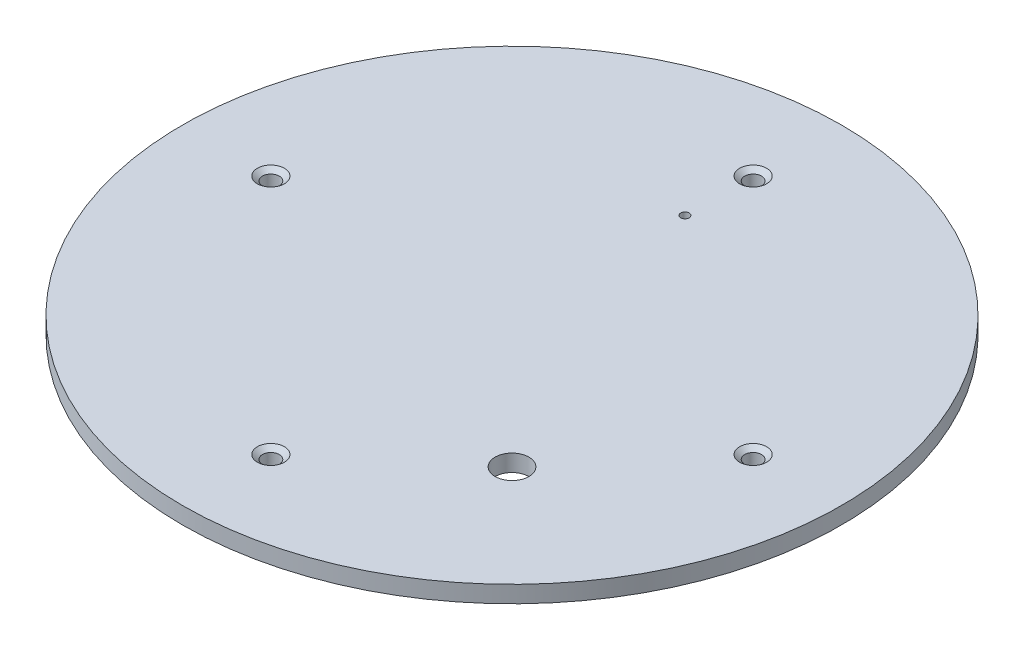
ISO-10303-21;
HEADER;
FILE_DESCRIPTION(('STEP AP214'),'2;1');
FILE_NAME('part.step','',(''),(''),'','','');
FILE_SCHEMA(('AUTOMOTIVE_DESIGN { 1 0 10303 214 1 1 1 1 }'));
ENDSEC;
DATA;
#1=APPLICATION_CONTEXT('core data for automotive mechanical design processes');
#2=APPLICATION_PROTOCOL_DEFINITION('international standard','automotive_design',2000,#1);
#3=PRODUCT_CONTEXT('',#1,'mechanical');
#4=PRODUCT('Part','Part','',(#3));
#5=PRODUCT_RELATED_PRODUCT_CATEGORY('part','',(#4));
#6=PRODUCT_DEFINITION_FORMATION('','',#4);
#7=PRODUCT_DEFINITION_CONTEXT('part definition',#1,'design');
#8=PRODUCT_DEFINITION('design','',#6,#7);
#9=PRODUCT_DEFINITION_SHAPE('','',#8);
#10=(LENGTH_UNIT() NAMED_UNIT(*) SI_UNIT(.MILLI.,.METRE.));
#11=(NAMED_UNIT(*) PLANE_ANGLE_UNIT() SI_UNIT($,.RADIAN.));
#12=(NAMED_UNIT(*) SI_UNIT($,.STERADIAN.) SOLID_ANGLE_UNIT());
#13=UNCERTAINTY_MEASURE_WITH_UNIT(LENGTH_MEASURE(1.E-05),#10,'distance_accuracy_value','');
#14=(GEOMETRIC_REPRESENTATION_CONTEXT(3) GLOBAL_UNCERTAINTY_ASSIGNED_CONTEXT((#13)) GLOBAL_UNIT_ASSIGNED_CONTEXT((#10,
#11,#12)) REPRESENTATION_CONTEXT('',''));
#15=CARTESIAN_POINT('',(0.,0.,0.));
#16=DIRECTION('',(0.,0.,1.));
#17=DIRECTION('',(1.,0.,0.));
#18=AXIS2_PLACEMENT_3D('',#15,#16,#17);
#19=CARTESIAN_POINT('',(0.,1.,0.));
#20=DIRECTION('',(0.,-1.,0.));
#21=DIRECTION('',(0.,0.,-1.));
#22=AXIS2_PLACEMENT_3D('',#19,#20,#21);
#23=CYLINDRICAL_SURFACE('',#22,19.53);
#24=CARTESIAN_POINT('',(0.,1.,0.));
#25=DIRECTION('',(0.,1.,0.));
#26=DIRECTION('',(0.,0.,1.));
#27=AXIS2_PLACEMENT_3D('',#24,#25,#26);
#28=CIRCLE('',#27,19.53);
#29=CARTESIAN_POINT('',(0.,1.,19.53));
#30=VERTEX_POINT('',#29);
#31=EDGE_CURVE('E10',#30,#30,#28,.T.);
#32=ORIENTED_EDGE('',*,*,#31,.F.);
#33=EDGE_LOOP('',(#32));
#34=FACE_BOUND('',#33,.T.);
#35=CARTESIAN_POINT('',(0.,0.,0.));
#36=DIRECTION('',(0.,1.,0.));
#37=DIRECTION('',(0.,0.,1.));
#38=AXIS2_PLACEMENT_3D('',#35,#36,#37);
#39=CIRCLE('',#38,19.53);
#40=CARTESIAN_POINT('',(0.,0.,19.53));
#41=VERTEX_POINT('',#40);
#42=EDGE_CURVE('E34',#41,#41,#39,.T.);
#43=ORIENTED_EDGE('',*,*,#42,.T.);
#44=EDGE_LOOP('',(#43));
#45=FACE_BOUND('',#44,.T.);
#46=ADVANCED_FACE('F31',(#34,#45),#23,.T.);
#47=CARTESIAN_POINT('',(0.,1.,0.));
#48=DIRECTION('',(0.,1.,0.));
#49=DIRECTION('',(0.,0.,1.));
#50=AXIS2_PLACEMENT_3D('',#47,#48,#49);
#51=PLANE('',#50);
#52=CARTESIAN_POINT('',(0.,1.,-14.29));
#53=DIRECTION('',(0.,1.,0.));
#54=DIRECTION('',(0.,0.,1.));
#55=AXIS2_PLACEMENT_3D('',#52,#53,#54);
#56=CIRCLE('',#55,0.8);
#57=CARTESIAN_POINT('',(0.,1.,-13.49));
#58=VERTEX_POINT('',#57);
#59=EDGE_CURVE('E87',#58,#58,#56,.T.);
#60=ORIENTED_EDGE('',*,*,#59,.F.);
#61=EDGE_LOOP('',(#60));
#62=FACE_BOUND('',#61,.T.);
#63=CARTESIAN_POINT('',(-14.29,1.,0.));
#64=DIRECTION('',(0.,1.,0.));
#65=DIRECTION('',(0.,0.,1.));
#66=AXIS2_PLACEMENT_3D('',#63,#64,#65);
#67=CIRCLE('',#66,0.8);
#68=CARTESIAN_POINT('',(-14.29,1.,0.8));
#69=VERTEX_POINT('',#68);
#70=EDGE_CURVE('E78',#69,#69,#67,.T.);
#71=ORIENTED_EDGE('',*,*,#70,.F.);
#72=EDGE_LOOP('',(#71));
#73=FACE_BOUND('',#72,.T.);
#74=CARTESIAN_POINT('',(0.,1.,14.29));
#75=DIRECTION('',(0.,1.,0.));
#76=DIRECTION('',(0.,0.,1.));
#77=AXIS2_PLACEMENT_3D('',#74,#75,#76);
#78=CIRCLE('',#77,0.8);
#79=CARTESIAN_POINT('',(0.,1.,15.09));
#80=VERTEX_POINT('',#79);
#81=EDGE_CURVE('E69',#80,#80,#78,.T.);
#82=ORIENTED_EDGE('',*,*,#81,.F.);
#83=EDGE_LOOP('',(#82));
#84=FACE_BOUND('',#83,.T.);
#85=CARTESIAN_POINT('',(14.29,1.,0.));
#86=DIRECTION('',(0.,1.,0.));
#87=DIRECTION('',(0.,0.,1.));
#88=AXIS2_PLACEMENT_3D('',#85,#86,#87);
#89=CIRCLE('',#88,0.8);
#90=CARTESIAN_POINT('',(14.29,1.,0.8));
#91=VERTEX_POINT('',#90);
#92=EDGE_CURVE('E60',#91,#91,#89,.T.);
#93=ORIENTED_EDGE('',*,*,#92,.F.);
#94=EDGE_LOOP('',(#93));
#95=FACE_BOUND('',#94,.T.);
#96=CARTESIAN_POINT('',(0.,1.,-10.25));
#97=DIRECTION('',(0.,1.,0.));
#98=DIRECTION('',(0.,0.,1.));
#99=AXIS2_PLACEMENT_3D('',#96,#97,#98);
#100=CIRCLE('',#99,0.25);
#101=CARTESIAN_POINT('',(0.,1.,-10.));
#102=VERTEX_POINT('',#101);
#103=EDGE_CURVE('E41',#102,#102,#100,.T.);
#104=ORIENTED_EDGE('',*,*,#103,.F.);
#105=EDGE_LOOP('',(#104));
#106=FACE_BOUND('',#105,.T.);
#107=CARTESIAN_POINT('',(7.77817459305202,1.,7.77817459305202));
#108=DIRECTION('',(0.,1.,0.));
#109=DIRECTION('',(0.,0.,1.));
#110=AXIS2_PLACEMENT_3D('',#107,#108,#109);
#111=CIRCLE('',#110,1.);
#112=CARTESIAN_POINT('',(7.77817459305202,1.,8.77817459305202));
#113=VERTEX_POINT('',#112);
#114=EDGE_CURVE('E45',#113,#113,#111,.T.);
#115=ORIENTED_EDGE('',*,*,#114,.F.);
#116=EDGE_LOOP('',(#115));
#117=FACE_BOUND('',#116,.T.);
#118=ORIENTED_EDGE('',*,*,#31,.T.);
#119=EDGE_LOOP('',(#118));
#120=FACE_BOUND('',#119,.T.);
#121=ADVANCED_FACE('F93',(#62,#73,#84,#95,#106,#117,#120),#51,.T.);
#122=CARTESIAN_POINT('',(0.,0.,0.));
#123=DIRECTION('',(0.,1.,0.));
#124=DIRECTION('',(0.,0.,1.));
#125=AXIS2_PLACEMENT_3D('',#122,#123,#124);
#126=PLANE('',#125);
#127=CARTESIAN_POINT('',(0.,0.,-14.29));
#128=DIRECTION('',(0.,1.,0.));
#129=DIRECTION('',(0.,0.,1.));
#130=AXIS2_PLACEMENT_3D('',#127,#128,#129);
#131=CIRCLE('',#130,0.499999999999988);
#132=CARTESIAN_POINT('',(0.,0.,-13.79));
#133=VERTEX_POINT('',#132);
#134=EDGE_CURVE('E81',#133,#133,#131,.T.);
#135=ORIENTED_EDGE('',*,*,#134,.T.);
#136=EDGE_LOOP('',(#135));
#137=FACE_BOUND('',#136,.T.);
#138=CARTESIAN_POINT('',(-14.29,0.,0.));
#139=DIRECTION('',(0.,1.,0.));
#140=DIRECTION('',(0.,0.,1.));
#141=AXIS2_PLACEMENT_3D('',#138,#139,#140);
#142=CIRCLE('',#141,0.499999999999988);
#143=CARTESIAN_POINT('',(-14.29,0.,0.499999999999988));
#144=VERTEX_POINT('',#143);
#145=EDGE_CURVE('E72',#144,#144,#142,.T.);
#146=ORIENTED_EDGE('',*,*,#145,.T.);
#147=EDGE_LOOP('',(#146));
#148=FACE_BOUND('',#147,.T.);
#149=CARTESIAN_POINT('',(0.,0.,14.29));
#150=DIRECTION('',(0.,1.,0.));
#151=DIRECTION('',(0.,0.,1.));
#152=AXIS2_PLACEMENT_3D('',#149,#150,#151);
#153=CIRCLE('',#152,0.499999999999988);
#154=CARTESIAN_POINT('',(0.,0.,14.79));
#155=VERTEX_POINT('',#154);
#156=EDGE_CURVE('E63',#155,#155,#153,.T.);
#157=ORIENTED_EDGE('',*,*,#156,.T.);
#158=EDGE_LOOP('',(#157));
#159=FACE_BOUND('',#158,.T.);
#160=CARTESIAN_POINT('',(14.29,0.,0.));
#161=DIRECTION('',(0.,1.,0.));
#162=DIRECTION('',(0.,0.,1.));
#163=AXIS2_PLACEMENT_3D('',#160,#161,#162);
#164=CIRCLE('',#163,0.499999999999988);
#165=CARTESIAN_POINT('',(14.29,0.,0.499999999999988));
#166=VERTEX_POINT('',#165);
#167=EDGE_CURVE('E52',#166,#166,#164,.T.);
#168=ORIENTED_EDGE('',*,*,#167,.T.);
#169=EDGE_LOOP('',(#168));
#170=FACE_BOUND('',#169,.T.);
#171=CARTESIAN_POINT('',(0.,0.,-10.25));
#172=DIRECTION('',(0.,1.,0.));
#173=DIRECTION('',(0.,0.,1.));
#174=AXIS2_PLACEMENT_3D('',#171,#172,#173);
#175=CIRCLE('',#174,0.25);
#176=CARTESIAN_POINT('',(0.,0.,-10.));
#177=VERTEX_POINT('',#176);
#178=EDGE_CURVE('E48',#177,#177,#175,.T.);
#179=ORIENTED_EDGE('',*,*,#178,.T.);
#180=EDGE_LOOP('',(#179));
#181=FACE_BOUND('',#180,.T.);
#182=CARTESIAN_POINT('',(7.77817459305202,0.,7.77817459305202));
#183=DIRECTION('',(0.,1.,0.));
#184=DIRECTION('',(0.,0.,1.));
#185=AXIS2_PLACEMENT_3D('',#182,#183,#184);
#186=CIRCLE('',#185,1.);
#187=CARTESIAN_POINT('',(7.77817459305202,0.,8.77817459305202));
#188=VERTEX_POINT('',#187);
#189=EDGE_CURVE('E49',#188,#188,#186,.T.);
#190=ORIENTED_EDGE('',*,*,#189,.T.);
#191=EDGE_LOOP('',(#190));
#192=FACE_BOUND('',#191,.T.);
#193=ORIENTED_EDGE('',*,*,#42,.F.);
#194=EDGE_LOOP('',(#193));
#195=FACE_BOUND('',#194,.T.);
#196=ADVANCED_FACE('F96',(#137,#148,#159,#170,#181,#192,#195),#126,.F.);
#197=CARTESIAN_POINT('',(7.77817459305202,0.,7.77817459305202));
#198=DIRECTION('',(0.,1.,0.));
#199=DIRECTION('',(0.,0.,1.));
#200=AXIS2_PLACEMENT_3D('',#197,#198,#199);
#201=CYLINDRICAL_SURFACE('',#200,1.);
#202=ORIENTED_EDGE('',*,*,#114,.T.);
#203=EDGE_LOOP('',(#202));
#204=FACE_BOUND('',#203,.T.);
#205=ORIENTED_EDGE('',*,*,#189,.F.);
#206=EDGE_LOOP('',(#205));
#207=FACE_BOUND('',#206,.T.);
#208=ADVANCED_FACE('F108',(#204,#207),#201,.F.);
#209=CARTESIAN_POINT('',(0.,0.,-10.25));
#210=DIRECTION('',(0.,1.,0.));
#211=DIRECTION('',(0.,0.,1.));
#212=AXIS2_PLACEMENT_3D('',#209,#210,#211);
#213=CYLINDRICAL_SURFACE('',#212,0.25);
#214=ORIENTED_EDGE('',*,*,#103,.T.);
#215=EDGE_LOOP('',(#214));
#216=FACE_BOUND('',#215,.T.);
#217=ORIENTED_EDGE('',*,*,#178,.F.);
#218=EDGE_LOOP('',(#217));
#219=FACE_BOUND('',#218,.T.);
#220=ADVANCED_FACE('F111',(#216,#219),#213,.F.);
#221=CARTESIAN_POINT('',(14.29,1.,0.));
#222=DIRECTION('',(0.,1.,0.));
#223=DIRECTION('',(0.,0.,1.));
#224=AXIS2_PLACEMENT_3D('',#221,#222,#223);
#225=CYLINDRICAL_SURFACE('',#224,0.499999999999994);
#226=ORIENTED_EDGE('',*,*,#167,.F.);
#227=EDGE_LOOP('',(#226));
#228=FACE_BOUND('',#227,.T.);
#229=CARTESIAN_POINT('',(14.29,0.748270110646816,0.));
#230=DIRECTION('',(0.,1.,0.));
#231=DIRECTION('',(0.,0.,1.));
#232=AXIS2_PLACEMENT_3D('',#229,#230,#231);
#233=CIRCLE('',#232,0.5);
#234=CARTESIAN_POINT('',(14.29,0.748270110646816,0.5));
#235=VERTEX_POINT('',#234);
#236=EDGE_CURVE('E57',#235,#235,#233,.T.);
#237=ORIENTED_EDGE('',*,*,#236,.T.);
#238=EDGE_LOOP('',(#237));
#239=FACE_BOUND('',#238,.T.);
#240=ADVANCED_FACE('F143',(#228,#239),#225,.F.);
#241=CARTESIAN_POINT('',(14.29,1.,0.));
#242=DIRECTION('',(0.,1.,0.));
#243=DIRECTION('',(0.,0.,1.));
#244=AXIS2_PLACEMENT_3D('',#241,#242,#243);
#245=CONICAL_SURFACE('',#244,0.8,0.872664625997164);
#246=ORIENTED_EDGE('',*,*,#236,.F.);
#247=EDGE_LOOP('',(#246));
#248=FACE_BOUND('',#247,.T.);
#249=ORIENTED_EDGE('',*,*,#92,.T.);
#250=EDGE_LOOP('',(#249));
#251=FACE_BOUND('',#250,.T.);
#252=ADVANCED_FACE('F150',(#248,#251),#245,.F.);
#253=CARTESIAN_POINT('',(0.,1.,14.29));
#254=DIRECTION('',(0.,1.,0.));
#255=DIRECTION('',(0.,0.,1.));
#256=AXIS2_PLACEMENT_3D('',#253,#254,#255);
#257=CYLINDRICAL_SURFACE('',#256,0.499999999999994);
#258=ORIENTED_EDGE('',*,*,#156,.F.);
#259=EDGE_LOOP('',(#258));
#260=FACE_BOUND('',#259,.T.);
#261=CARTESIAN_POINT('',(0.,0.748270110646816,14.29));
#262=DIRECTION('',(0.,1.,0.));
#263=DIRECTION('',(0.,0.,1.));
#264=AXIS2_PLACEMENT_3D('',#261,#262,#263);
#265=CIRCLE('',#264,0.5);
#266=CARTESIAN_POINT('',(0.,0.748270110646816,14.79));
#267=VERTEX_POINT('',#266);
#268=EDGE_CURVE('E66',#267,#267,#265,.T.);
#269=ORIENTED_EDGE('',*,*,#268,.T.);
#270=EDGE_LOOP('',(#269));
#271=FACE_BOUND('',#270,.T.);
#272=ADVANCED_FACE('F158',(#260,#271),#257,.F.);
#273=CARTESIAN_POINT('',(0.,1.,14.29));
#274=DIRECTION('',(0.,1.,0.));
#275=DIRECTION('',(0.,0.,1.));
#276=AXIS2_PLACEMENT_3D('',#273,#274,#275);
#277=CONICAL_SURFACE('',#276,0.8,0.872664625997165);
#278=ORIENTED_EDGE('',*,*,#268,.F.);
#279=EDGE_LOOP('',(#278));
#280=FACE_BOUND('',#279,.T.);
#281=ORIENTED_EDGE('',*,*,#81,.T.);
#282=EDGE_LOOP('',(#281));
#283=FACE_BOUND('',#282,.T.);
#284=ADVANCED_FACE('F166',(#280,#283),#277,.F.);
#285=CARTESIAN_POINT('',(-14.29,1.,0.));
#286=DIRECTION('',(0.,1.,0.));
#287=DIRECTION('',(0.,0.,1.));
#288=AXIS2_PLACEMENT_3D('',#285,#286,#287);
#289=CYLINDRICAL_SURFACE('',#288,0.499999999999994);
#290=ORIENTED_EDGE('',*,*,#145,.F.);
#291=EDGE_LOOP('',(#290));
#292=FACE_BOUND('',#291,.T.);
#293=CARTESIAN_POINT('',(-14.29,0.748270110646816,0.));
#294=DIRECTION('',(0.,1.,0.));
#295=DIRECTION('',(0.,0.,1.));
#296=AXIS2_PLACEMENT_3D('',#293,#294,#295);
#297=CIRCLE('',#296,0.5);
#298=CARTESIAN_POINT('',(-14.29,0.748270110646816,0.5));
#299=VERTEX_POINT('',#298);
#300=EDGE_CURVE('E75',#299,#299,#297,.T.);
#301=ORIENTED_EDGE('',*,*,#300,.T.);
#302=EDGE_LOOP('',(#301));
#303=FACE_BOUND('',#302,.T.);
#304=ADVANCED_FACE('F174',(#292,#303),#289,.F.);
#305=CARTESIAN_POINT('',(-14.29,1.,0.));
#306=DIRECTION('',(0.,1.,0.));
#307=DIRECTION('',(0.,0.,1.));
#308=AXIS2_PLACEMENT_3D('',#305,#306,#307);
#309=CONICAL_SURFACE('',#308,0.8,0.872664625997164);
#310=ORIENTED_EDGE('',*,*,#300,.F.);
#311=EDGE_LOOP('',(#310));
#312=FACE_BOUND('',#311,.T.);
#313=ORIENTED_EDGE('',*,*,#70,.T.);
#314=EDGE_LOOP('',(#313));
#315=FACE_BOUND('',#314,.T.);
#316=ADVANCED_FACE('F182',(#312,#315),#309,.F.);
#317=CARTESIAN_POINT('',(0.,1.,-14.29));
#318=DIRECTION('',(0.,1.,0.));
#319=DIRECTION('',(0.,0.,1.));
#320=AXIS2_PLACEMENT_3D('',#317,#318,#319);
#321=CYLINDRICAL_SURFACE('',#320,0.499999999999994);
#322=ORIENTED_EDGE('',*,*,#134,.F.);
#323=EDGE_LOOP('',(#322));
#324=FACE_BOUND('',#323,.T.);
#325=CARTESIAN_POINT('',(0.,0.748270110646816,-14.29));
#326=DIRECTION('',(0.,1.,0.));
#327=DIRECTION('',(0.,0.,1.));
#328=AXIS2_PLACEMENT_3D('',#325,#326,#327);
#329=CIRCLE('',#328,0.5);
#330=CARTESIAN_POINT('',(0.,0.748270110646816,-13.79));
#331=VERTEX_POINT('',#330);
#332=EDGE_CURVE('E84',#331,#331,#329,.T.);
#333=ORIENTED_EDGE('',*,*,#332,.T.);
#334=EDGE_LOOP('',(#333));
#335=FACE_BOUND('',#334,.T.);
#336=ADVANCED_FACE('F190',(#324,#335),#321,.F.);
#337=CARTESIAN_POINT('',(0.,1.,-14.29));
#338=DIRECTION('',(0.,1.,0.));
#339=DIRECTION('',(0.,0.,1.));
#340=AXIS2_PLACEMENT_3D('',#337,#338,#339);
#341=CONICAL_SURFACE('',#340,0.8,0.872664625997165);
#342=ORIENTED_EDGE('',*,*,#332,.F.);
#343=EDGE_LOOP('',(#342));
#344=FACE_BOUND('',#343,.T.);
#345=ORIENTED_EDGE('',*,*,#59,.T.);
#346=EDGE_LOOP('',(#345));
#347=FACE_BOUND('',#346,.T.);
#348=ADVANCED_FACE('F91',(#344,#347),#341,.F.);
#349=CLOSED_SHELL('',(#46,#121,#196,#208,#220,#240,#252,#272,#284,#304,#316,#336,#348));
#350=MANIFOLD_SOLID_BREP('B2',#349);
#351=ADVANCED_BREP_SHAPE_REPRESENTATION('',(#18,#350),#14);
#352=SHAPE_DEFINITION_REPRESENTATION(#9,#351);
ENDSEC;
END-ISO-10303-21;
